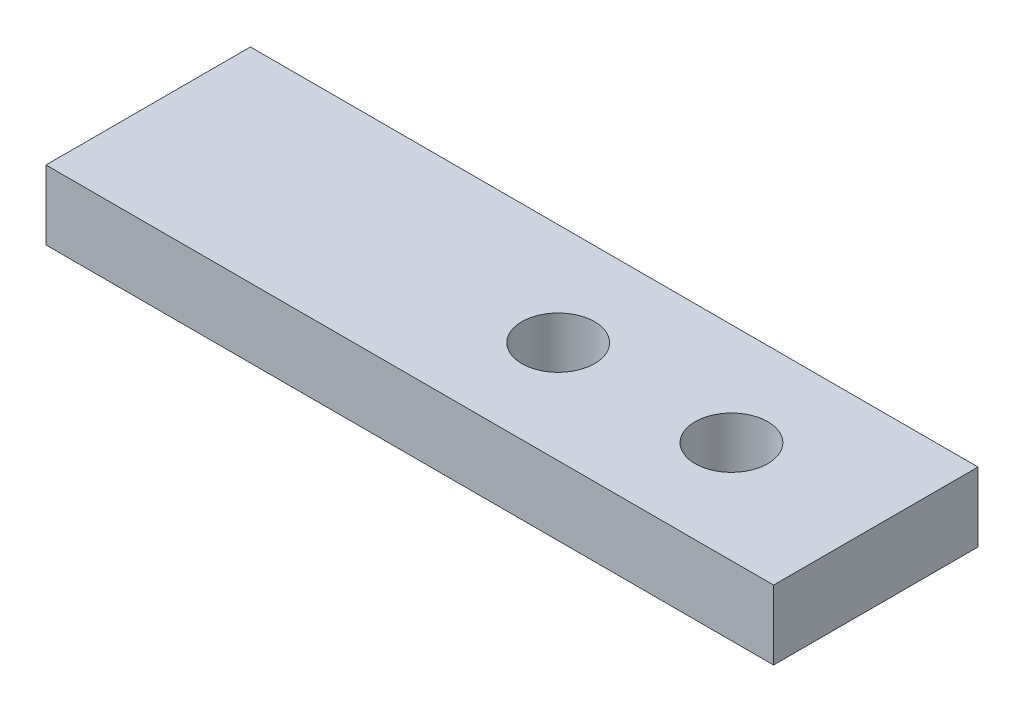
ISO-10303-21;
HEADER;
FILE_DESCRIPTION(('STEP AP214'),'2;1');
FILE_NAME('part.step','',(''),(''),'','','');
FILE_SCHEMA(('AUTOMOTIVE_DESIGN { 1 0 10303 214 1 1 1 1 }'));
ENDSEC;
DATA;
#1=APPLICATION_CONTEXT('core data for automotive mechanical design processes');
#2=APPLICATION_PROTOCOL_DEFINITION('international standard','automotive_design',2000,#1);
#3=PRODUCT_CONTEXT('',#1,'mechanical');
#4=PRODUCT('Part','Part','',(#3));
#5=PRODUCT_RELATED_PRODUCT_CATEGORY('part','',(#4));
#6=PRODUCT_DEFINITION_FORMATION('','',#4);
#7=PRODUCT_DEFINITION_CONTEXT('part definition',#1,'design');
#8=PRODUCT_DEFINITION('design','',#6,#7);
#9=PRODUCT_DEFINITION_SHAPE('','',#8);
#10=(LENGTH_UNIT() NAMED_UNIT(*) SI_UNIT(.MILLI.,.METRE.));
#11=(NAMED_UNIT(*) PLANE_ANGLE_UNIT() SI_UNIT($,.RADIAN.));
#12=(NAMED_UNIT(*) SI_UNIT($,.STERADIAN.) SOLID_ANGLE_UNIT());
#13=UNCERTAINTY_MEASURE_WITH_UNIT(LENGTH_MEASURE(1.E-05),#10,'distance_accuracy_value','');
#14=(GEOMETRIC_REPRESENTATION_CONTEXT(3) GLOBAL_UNCERTAINTY_ASSIGNED_CONTEXT((#13)) GLOBAL_UNIT_ASSIGNED_CONTEXT((#10,
#11,#12)) REPRESENTATION_CONTEXT('',''));
#15=CARTESIAN_POINT('',(0.,0.,0.));
#16=DIRECTION('',(0.,0.,1.));
#17=DIRECTION('',(1.,0.,0.));
#18=AXIS2_PLACEMENT_3D('',#15,#16,#17);
#19=CARTESIAN_POINT('',(0.,3.048,0.));
#20=DIRECTION('',(0.,1.,0.));
#21=DIRECTION('',(0.,0.,1.));
#22=AXIS2_PLACEMENT_3D('',#19,#20,#21);
#23=PLANE('',#22);
#24=CARTESIAN_POINT('',(9.652,3.048,0.));
#25=DIRECTION('',(0.,1.,0.));
#26=DIRECTION('',(0.,0.,1.));
#27=AXIS2_PLACEMENT_3D('',#24,#25,#26);
#28=CIRCLE('',#27,1.6002);
#29=CARTESIAN_POINT('',(9.652,3.048,-1.6002));
#30=VERTEX_POINT('',#29);
#31=EDGE_CURVE('E118',#30,#30,#28,.T.);
#32=ORIENTED_EDGE('',*,*,#31,.F.);
#33=EDGE_LOOP('',(#32));
#34=FACE_BOUND('',#33,.T.);
#35=DIRECTION('',(0.,0.,-1.));
#36=VECTOR('',#35,1.);
#37=CARTESIAN_POINT('',(16.002,3.048,-4.4958));
#38=LINE('',#37,#36);
#39=CARTESIAN_POINT('',(16.002,3.048,4.4958));
#40=VERTEX_POINT('',#39);
#41=CARTESIAN_POINT('',(16.002,3.048,-4.4958));
#42=VERTEX_POINT('',#41);
#43=EDGE_CURVE('E98',#40,#42,#38,.T.);
#44=ORIENTED_EDGE('',*,*,#43,.T.);
#45=DIRECTION('',(-1.,0.,0.));
#46=VECTOR('',#45,1.);
#47=CARTESIAN_POINT('',(-16.002,3.048,-4.4958));
#48=LINE('',#47,#46);
#49=CARTESIAN_POINT('',(-16.002,3.048,-4.4958));
#50=VERTEX_POINT('',#49);
#51=EDGE_CURVE('E93',#42,#50,#48,.T.);
#52=ORIENTED_EDGE('',*,*,#51,.T.);
#53=DIRECTION('',(0.,0.,1.));
#54=VECTOR('',#53,1.);
#55=CARTESIAN_POINT('',(-16.002,3.048,-4.4958));
#56=LINE('',#55,#54);
#57=CARTESIAN_POINT('',(-16.002,3.048,4.4958));
#58=VERTEX_POINT('',#57);
#59=EDGE_CURVE('E96',#50,#58,#56,.T.);
#60=ORIENTED_EDGE('',*,*,#59,.T.);
#61=DIRECTION('',(1.,0.,0.));
#62=VECTOR('',#61,1.);
#63=CARTESIAN_POINT('',(-16.002,3.048,4.4958));
#64=LINE('',#63,#62);
#65=EDGE_CURVE('E63',#58,#40,#64,.T.);
#66=ORIENTED_EDGE('',*,*,#65,.T.);
#67=EDGE_LOOP('',(#44,#52,#60,#66));
#68=FACE_BOUND('',#67,.T.);
#69=CARTESIAN_POINT('',(2.032,3.048,0.));
#70=DIRECTION('',(0.,1.,0.));
#71=DIRECTION('',(0.,0.,1.));
#72=AXIS2_PLACEMENT_3D('',#69,#70,#71);
#73=CIRCLE('',#72,1.6002);
#74=CARTESIAN_POINT('',(2.032,3.048,-1.6002));
#75=VERTEX_POINT('',#74);
#76=EDGE_CURVE('E140',#75,#75,#73,.T.);
#77=ORIENTED_EDGE('',*,*,#76,.F.);
#78=EDGE_LOOP('',(#77));
#79=FACE_BOUND('',#78,.T.);
#80=ADVANCED_FACE('F45',(#34,#68,#79),#23,.T.);
#81=CARTESIAN_POINT('',(0.,0.,0.));
#82=DIRECTION('',(0.,1.,0.));
#83=DIRECTION('',(0.,0.,1.));
#84=AXIS2_PLACEMENT_3D('',#81,#82,#83);
#85=PLANE('',#84);
#86=DIRECTION('',(0.,0.,-1.));
#87=VECTOR('',#86,1.);
#88=CARTESIAN_POINT('',(16.002,0.,-4.4958));
#89=LINE('',#88,#87);
#90=CARTESIAN_POINT('',(16.002,0.,4.4958));
#91=VERTEX_POINT('',#90);
#92=CARTESIAN_POINT('',(16.002,0.,-4.4958));
#93=VERTEX_POINT('',#92);
#94=EDGE_CURVE('E114',#91,#93,#89,.T.);
#95=ORIENTED_EDGE('',*,*,#94,.F.);
#96=DIRECTION('',(1.,0.,0.));
#97=VECTOR('',#96,1.);
#98=CARTESIAN_POINT('',(-16.002,0.,4.4958));
#99=LINE('',#98,#97);
#100=CARTESIAN_POINT('',(-16.002,0.,4.4958));
#101=VERTEX_POINT('',#100);
#102=EDGE_CURVE('E86',#101,#91,#99,.T.);
#103=ORIENTED_EDGE('',*,*,#102,.F.);
#104=DIRECTION('',(0.,0.,1.));
#105=VECTOR('',#104,1.);
#106=CARTESIAN_POINT('',(-16.002,0.,-4.4958));
#107=LINE('',#106,#105);
#108=CARTESIAN_POINT('',(-16.002,0.,-4.4958));
#109=VERTEX_POINT('',#108);
#110=EDGE_CURVE('E80',#109,#101,#107,.T.);
#111=ORIENTED_EDGE('',*,*,#110,.F.);
#112=DIRECTION('',(-1.,0.,0.));
#113=VECTOR('',#112,1.);
#114=CARTESIAN_POINT('',(-16.002,0.,-4.4958));
#115=LINE('',#114,#113);
#116=EDGE_CURVE('E103',#93,#109,#115,.T.);
#117=ORIENTED_EDGE('',*,*,#116,.F.);
#118=EDGE_LOOP('',(#95,#103,#111,#117));
#119=FACE_BOUND('',#118,.T.);
#120=CARTESIAN_POINT('',(9.652,0.,0.));
#121=DIRECTION('',(0.,1.,0.));
#122=DIRECTION('',(0.,0.,1.));
#123=AXIS2_PLACEMENT_3D('',#120,#121,#122);
#124=CIRCLE('',#123,1.6002);
#125=CARTESIAN_POINT('',(9.652,0.,-1.6002));
#126=VERTEX_POINT('',#125);
#127=EDGE_CURVE('E136',#126,#126,#124,.T.);
#128=ORIENTED_EDGE('',*,*,#127,.T.);
#129=EDGE_LOOP('',(#128));
#130=FACE_BOUND('',#129,.T.);
#131=CARTESIAN_POINT('',(2.032,0.,0.));
#132=DIRECTION('',(0.,1.,0.));
#133=DIRECTION('',(0.,0.,1.));
#134=AXIS2_PLACEMENT_3D('',#131,#132,#133);
#135=CIRCLE('',#134,1.6002);
#136=CARTESIAN_POINT('',(2.032,0.,-1.6002));
#137=VERTEX_POINT('',#136);
#138=EDGE_CURVE('E144',#137,#137,#135,.T.);
#139=ORIENTED_EDGE('',*,*,#138,.T.);
#140=EDGE_LOOP('',(#139));
#141=FACE_BOUND('',#140,.T.);
#142=ADVANCED_FACE('F131',(#119,#130,#141),#85,.F.);
#143=CARTESIAN_POINT('',(16.002,3.048,-4.4958));
#144=DIRECTION('',(-1.,0.,0.));
#145=DIRECTION('',(0.,0.,1.));
#146=AXIS2_PLACEMENT_3D('',#143,#144,#145);
#147=PLANE('',#146);
#148=ORIENTED_EDGE('',*,*,#94,.T.);
#149=DIRECTION('',(0.,-1.,0.));
#150=VECTOR('',#149,1.);
#151=CARTESIAN_POINT('',(16.002,3.048,-4.4958));
#152=LINE('',#151,#150);
#153=EDGE_CURVE('E11',#42,#93,#152,.T.);
#154=ORIENTED_EDGE('',*,*,#153,.F.);
#155=ORIENTED_EDGE('',*,*,#43,.F.);
#156=DIRECTION('',(0.,-1.,0.));
#157=VECTOR('',#156,1.);
#158=CARTESIAN_POINT('',(16.002,3.048,4.4958));
#159=LINE('',#158,#157);
#160=EDGE_CURVE('E110',#40,#91,#159,.T.);
#161=ORIENTED_EDGE('',*,*,#160,.T.);
#162=EDGE_LOOP('',(#148,#154,#155,#161));
#163=FACE_BOUND('',#162,.T.);
#164=ADVANCED_FACE('F47',(#163),#147,.F.);
#165=CARTESIAN_POINT('',(-16.002,3.048,-4.4958));
#166=DIRECTION('',(0.,0.,1.));
#167=DIRECTION('',(1.,0.,0.));
#168=AXIS2_PLACEMENT_3D('',#165,#166,#167);
#169=PLANE('',#168);
#170=ORIENTED_EDGE('',*,*,#116,.T.);
#171=DIRECTION('',(0.,-1.,0.));
#172=VECTOR('',#171,1.);
#173=CARTESIAN_POINT('',(-16.002,3.048,-4.4958));
#174=LINE('',#173,#172);
#175=EDGE_CURVE('E55',#50,#109,#174,.T.);
#176=ORIENTED_EDGE('',*,*,#175,.F.);
#177=ORIENTED_EDGE('',*,*,#51,.F.);
#178=ORIENTED_EDGE('',*,*,#153,.T.);
#179=EDGE_LOOP('',(#170,#176,#177,#178));
#180=FACE_BOUND('',#179,.T.);
#181=ADVANCED_FACE('F102',(#180),#169,.F.);
#182=CARTESIAN_POINT('',(-16.002,3.048,-4.4958));
#183=DIRECTION('',(1.,0.,0.));
#184=DIRECTION('',(0.,0.,-1.));
#185=AXIS2_PLACEMENT_3D('',#182,#183,#184);
#186=PLANE('',#185);
#187=ORIENTED_EDGE('',*,*,#110,.T.);
#188=DIRECTION('',(0.,-1.,0.));
#189=VECTOR('',#188,1.);
#190=CARTESIAN_POINT('',(-16.002,3.048,4.4958));
#191=LINE('',#190,#189);
#192=EDGE_CURVE('E105',#58,#101,#191,.T.);
#193=ORIENTED_EDGE('',*,*,#192,.F.);
#194=ORIENTED_EDGE('',*,*,#59,.F.);
#195=ORIENTED_EDGE('',*,*,#175,.T.);
#196=EDGE_LOOP('',(#187,#193,#194,#195));
#197=FACE_BOUND('',#196,.T.);
#198=ADVANCED_FACE('F106',(#197),#186,.F.);
#199=CARTESIAN_POINT('',(-16.002,3.048,4.4958));
#200=DIRECTION('',(0.,0.,-1.));
#201=DIRECTION('',(-1.,0.,0.));
#202=AXIS2_PLACEMENT_3D('',#199,#200,#201);
#203=PLANE('',#202);
#204=ORIENTED_EDGE('',*,*,#102,.T.);
#205=ORIENTED_EDGE('',*,*,#160,.F.);
#206=ORIENTED_EDGE('',*,*,#65,.F.);
#207=ORIENTED_EDGE('',*,*,#192,.T.);
#208=EDGE_LOOP('',(#204,#205,#206,#207));
#209=FACE_BOUND('',#208,.T.);
#210=ADVANCED_FACE('F128',(#209),#203,.F.);
#211=CARTESIAN_POINT('',(9.652,3.048,0.));
#212=DIRECTION('',(0.,-1.,0.));
#213=DIRECTION('',(0.,0.,-1.));
#214=AXIS2_PLACEMENT_3D('',#211,#212,#213);
#215=CYLINDRICAL_SURFACE('',#214,1.6002);
#216=CARTESIAN_POINT('',(9.652,3.048,-1.6002));
#217=CARTESIAN_POINT('',(9.652,3.01625,-1.6002));
#218=CARTESIAN_POINT('',(9.652,2.9845,-1.6002));
#219=CARTESIAN_POINT('',(9.652,2.921,-1.6002));
#220=CARTESIAN_POINT('',(9.652,2.88925,-1.6002));
#221=CARTESIAN_POINT('',(9.652,2.82575,-1.6002));
#222=CARTESIAN_POINT('',(9.652,2.794,-1.6002));
#223=CARTESIAN_POINT('',(9.652,2.7305,-1.6002));
#224=CARTESIAN_POINT('',(9.652,2.69875,-1.6002));
#225=CARTESIAN_POINT('',(9.652,2.63525,-1.6002));
#226=CARTESIAN_POINT('',(9.652,2.6035,-1.6002));
#227=CARTESIAN_POINT('',(9.652,2.54,-1.6002));
#228=CARTESIAN_POINT('',(9.652,2.50825,-1.6002));
#229=CARTESIAN_POINT('',(9.652,2.44475,-1.6002));
#230=CARTESIAN_POINT('',(9.652,2.413,-1.6002));
#231=CARTESIAN_POINT('',(9.652,2.3495,-1.6002));
#232=CARTESIAN_POINT('',(9.652,2.31775,-1.6002));
#233=CARTESIAN_POINT('',(9.652,2.25425,-1.6002));
#234=CARTESIAN_POINT('',(9.652,2.2225,-1.6002));
#235=CARTESIAN_POINT('',(9.652,2.159,-1.6002));
#236=CARTESIAN_POINT('',(9.652,2.12725,-1.6002));
#237=CARTESIAN_POINT('',(9.652,2.06375,-1.6002));
#238=CARTESIAN_POINT('',(9.652,2.032,-1.6002));
#239=CARTESIAN_POINT('',(9.652,1.9685,-1.6002));
#240=CARTESIAN_POINT('',(9.652,1.93675,-1.6002));
#241=CARTESIAN_POINT('',(9.652,1.87325,-1.6002));
#242=CARTESIAN_POINT('',(9.652,1.8415,-1.6002));
#243=CARTESIAN_POINT('',(9.652,1.778,-1.6002));
#244=CARTESIAN_POINT('',(9.652,1.74625,-1.6002));
#245=CARTESIAN_POINT('',(9.652,1.68275,-1.6002));
#246=CARTESIAN_POINT('',(9.652,1.651,-1.6002));
#247=CARTESIAN_POINT('',(9.652,1.5875,-1.6002));
#248=CARTESIAN_POINT('',(9.652,1.55575,-1.6002));
#249=CARTESIAN_POINT('',(9.652,1.49225,-1.6002));
#250=CARTESIAN_POINT('',(9.652,1.4605,-1.6002));
#251=CARTESIAN_POINT('',(9.652,1.397,-1.6002));
#252=CARTESIAN_POINT('',(9.652,1.36525,-1.6002));
#253=CARTESIAN_POINT('',(9.652,1.30175,-1.6002));
#254=CARTESIAN_POINT('',(9.652,1.27,-1.6002));
#255=CARTESIAN_POINT('',(9.652,1.2065,-1.6002));
#256=CARTESIAN_POINT('',(9.652,1.17475,-1.6002));
#257=CARTESIAN_POINT('',(9.652,1.11125,-1.6002));
#258=CARTESIAN_POINT('',(9.652,1.0795,-1.6002));
#259=CARTESIAN_POINT('',(9.652,1.016,-1.6002));
#260=CARTESIAN_POINT('',(9.652,0.98425,-1.6002));
#261=CARTESIAN_POINT('',(9.652,0.92075,-1.6002));
#262=CARTESIAN_POINT('',(9.652,0.889,-1.6002));
#263=CARTESIAN_POINT('',(9.652,0.8255,-1.6002));
#264=CARTESIAN_POINT('',(9.652,0.79375,-1.6002));
#265=CARTESIAN_POINT('',(9.652,0.73025,-1.6002));
#266=CARTESIAN_POINT('',(9.652,0.6985,-1.6002));
#267=CARTESIAN_POINT('',(9.652,0.635,-1.6002));
#268=CARTESIAN_POINT('',(9.652,0.60325,-1.6002));
#269=CARTESIAN_POINT('',(9.652,0.53975,-1.6002));
#270=CARTESIAN_POINT('',(9.652,0.508,-1.6002));
#271=CARTESIAN_POINT('',(9.652,0.4445,-1.6002));
#272=CARTESIAN_POINT('',(9.652,0.41275,-1.6002));
#273=CARTESIAN_POINT('',(9.652,0.34925,-1.6002));
#274=CARTESIAN_POINT('',(9.652,0.3175,-1.6002));
#275=CARTESIAN_POINT('',(9.652,0.254,-1.6002));
#276=CARTESIAN_POINT('',(9.652,0.22225,-1.6002));
#277=CARTESIAN_POINT('',(9.652,0.15875,-1.6002));
#278=CARTESIAN_POINT('',(9.652,0.127,-1.6002));
#279=CARTESIAN_POINT('',(9.652,0.0634999999999999,-1.6002));
#280=CARTESIAN_POINT('',(9.652,0.03175,-1.6002));
#281=CARTESIAN_POINT('',(9.652,0.,-1.6002));
#282=B_SPLINE_CURVE_WITH_KNOTS('',3,(#216,#217,#218,#219,#220,#221,#222,#223,#224,#225,#226,
#227,#228,#229,#230,#231,#232,#233,#234,#235,#236,#237,#238,#239,#240,#241,#242,#243,#244,#245,
#246,#247,#248,#249,#250,#251,#252,#253,#254,#255,#256,#257,#258,#259,#260,#261,#262,#263,#264,
#265,#266,#267,#268,#269,#270,#271,#272,#273,#274,#275,#276,#277,#278,#279,#280,#281),
.UNSPECIFIED.,.F.,.F.,(4,2,2,2,2,2,2,2,2,2,2,2,2,2,2,2,2,2,2,2,2,2,2,2,2,2,2,2,2,2,2,2,4),(0.,
0.0952499999999998,0.1905,0.28575,0.381,0.47625,0.5715,0.66675,0.762,0.85725,0.9525,1.04775,
1.143,1.23825,1.3335,1.42875,1.524,1.61925,1.7145,1.80975,1.905,2.00025,2.0955,2.19075,2.286,
2.38125,2.4765,2.57175,2.667,2.76225,2.8575,2.95275,3.048),.UNSPECIFIED.);
#283=EDGE_CURVE('BSEAM163',#30,#126,#282,.T.);
#284=ORIENTED_EDGE('',*,*,#31,.T.);
#285=ORIENTED_EDGE('',*,*,#127,.F.);
#286=ORIENTED_EDGE('',*,*,#283,.T.);
#287=ORIENTED_EDGE('',*,*,#283,.F.);
#288=EDGE_LOOP('',(#284,#286,#285,#287));
#289=FACE_BOUND('',#288,.T.);
#290=ADVANCED_FACE('F163',(#289),#215,.F.);
#291=CARTESIAN_POINT('',(2.032,3.048,0.));
#292=DIRECTION('',(0.,-1.,0.));
#293=DIRECTION('',(0.,0.,-1.));
#294=AXIS2_PLACEMENT_3D('',#291,#292,#293);
#295=CYLINDRICAL_SURFACE('',#294,1.6002);
#296=CARTESIAN_POINT('',(2.032,3.048,-1.6002));
#297=CARTESIAN_POINT('',(2.032,3.01625,-1.6002));
#298=CARTESIAN_POINT('',(2.032,2.9845,-1.6002));
#299=CARTESIAN_POINT('',(2.032,2.921,-1.6002));
#300=CARTESIAN_POINT('',(2.032,2.88925,-1.6002));
#301=CARTESIAN_POINT('',(2.032,2.82575,-1.6002));
#302=CARTESIAN_POINT('',(2.032,2.794,-1.6002));
#303=CARTESIAN_POINT('',(2.032,2.7305,-1.6002));
#304=CARTESIAN_POINT('',(2.032,2.69875,-1.6002));
#305=CARTESIAN_POINT('',(2.032,2.63525,-1.6002));
#306=CARTESIAN_POINT('',(2.032,2.6035,-1.6002));
#307=CARTESIAN_POINT('',(2.032,2.54,-1.6002));
#308=CARTESIAN_POINT('',(2.032,2.50825,-1.6002));
#309=CARTESIAN_POINT('',(2.032,2.44475,-1.6002));
#310=CARTESIAN_POINT('',(2.032,2.413,-1.6002));
#311=CARTESIAN_POINT('',(2.032,2.3495,-1.6002));
#312=CARTESIAN_POINT('',(2.032,2.31775,-1.6002));
#313=CARTESIAN_POINT('',(2.032,2.25425,-1.6002));
#314=CARTESIAN_POINT('',(2.032,2.2225,-1.6002));
#315=CARTESIAN_POINT('',(2.032,2.159,-1.6002));
#316=CARTESIAN_POINT('',(2.032,2.12725,-1.6002));
#317=CARTESIAN_POINT('',(2.032,2.06375,-1.6002));
#318=CARTESIAN_POINT('',(2.032,2.032,-1.6002));
#319=CARTESIAN_POINT('',(2.032,1.9685,-1.6002));
#320=CARTESIAN_POINT('',(2.032,1.93675,-1.6002));
#321=CARTESIAN_POINT('',(2.032,1.87325,-1.6002));
#322=CARTESIAN_POINT('',(2.032,1.8415,-1.6002));
#323=CARTESIAN_POINT('',(2.032,1.778,-1.6002));
#324=CARTESIAN_POINT('',(2.032,1.74625,-1.6002));
#325=CARTESIAN_POINT('',(2.032,1.68275,-1.6002));
#326=CARTESIAN_POINT('',(2.032,1.651,-1.6002));
#327=CARTESIAN_POINT('',(2.032,1.5875,-1.6002));
#328=CARTESIAN_POINT('',(2.032,1.55575,-1.6002));
#329=CARTESIAN_POINT('',(2.032,1.49225,-1.6002));
#330=CARTESIAN_POINT('',(2.032,1.4605,-1.6002));
#331=CARTESIAN_POINT('',(2.032,1.397,-1.6002));
#332=CARTESIAN_POINT('',(2.032,1.36525,-1.6002));
#333=CARTESIAN_POINT('',(2.032,1.30175,-1.6002));
#334=CARTESIAN_POINT('',(2.032,1.27,-1.6002));
#335=CARTESIAN_POINT('',(2.032,1.2065,-1.6002));
#336=CARTESIAN_POINT('',(2.032,1.17475,-1.6002));
#337=CARTESIAN_POINT('',(2.032,1.11125,-1.6002));
#338=CARTESIAN_POINT('',(2.032,1.0795,-1.6002));
#339=CARTESIAN_POINT('',(2.032,1.016,-1.6002));
#340=CARTESIAN_POINT('',(2.032,0.98425,-1.6002));
#341=CARTESIAN_POINT('',(2.032,0.92075,-1.6002));
#342=CARTESIAN_POINT('',(2.032,0.889,-1.6002));
#343=CARTESIAN_POINT('',(2.032,0.8255,-1.6002));
#344=CARTESIAN_POINT('',(2.032,0.79375,-1.6002));
#345=CARTESIAN_POINT('',(2.032,0.73025,-1.6002));
#346=CARTESIAN_POINT('',(2.032,0.6985,-1.6002));
#347=CARTESIAN_POINT('',(2.032,0.635,-1.6002));
#348=CARTESIAN_POINT('',(2.032,0.60325,-1.6002));
#349=CARTESIAN_POINT('',(2.032,0.53975,-1.6002));
#350=CARTESIAN_POINT('',(2.032,0.508,-1.6002));
#351=CARTESIAN_POINT('',(2.032,0.4445,-1.6002));
#352=CARTESIAN_POINT('',(2.032,0.41275,-1.6002));
#353=CARTESIAN_POINT('',(2.032,0.34925,-1.6002));
#354=CARTESIAN_POINT('',(2.032,0.3175,-1.6002));
#355=CARTESIAN_POINT('',(2.032,0.254,-1.6002));
#356=CARTESIAN_POINT('',(2.032,0.22225,-1.6002));
#357=CARTESIAN_POINT('',(2.032,0.15875,-1.6002));
#358=CARTESIAN_POINT('',(2.032,0.127,-1.6002));
#359=CARTESIAN_POINT('',(2.032,0.0634999999999999,-1.6002));
#360=CARTESIAN_POINT('',(2.032,0.03175,-1.6002));
#361=CARTESIAN_POINT('',(2.032,0.,-1.6002));
#362=B_SPLINE_CURVE_WITH_KNOTS('',3,(#296,#297,#298,#299,#300,#301,#302,#303,#304,#305,#306,
#307,#308,#309,#310,#311,#312,#313,#314,#315,#316,#317,#318,#319,#320,#321,#322,#323,#324,#325,
#326,#327,#328,#329,#330,#331,#332,#333,#334,#335,#336,#337,#338,#339,#340,#341,#342,#343,#344,
#345,#346,#347,#348,#349,#350,#351,#352,#353,#354,#355,#356,#357,#358,#359,#360,#361),
.UNSPECIFIED.,.F.,.F.,(4,2,2,2,2,2,2,2,2,2,2,2,2,2,2,2,2,2,2,2,2,2,2,2,2,2,2,2,2,2,2,2,4),(0.,
0.0952499999999998,0.1905,0.28575,0.381,0.47625,0.5715,0.66675,0.762,0.85725,0.9525,1.04775,
1.143,1.23825,1.3335,1.42875,1.524,1.61925,1.7145,1.80975,1.905,2.00025,2.0955,2.19075,2.286,
2.38125,2.4765,2.57175,2.667,2.76225,2.8575,2.95275,3.048),.UNSPECIFIED.);
#363=EDGE_CURVE('BSEAM152',#75,#137,#362,.T.);
#364=ORIENTED_EDGE('',*,*,#76,.T.);
#365=ORIENTED_EDGE('',*,*,#138,.F.);
#366=ORIENTED_EDGE('',*,*,#363,.T.);
#367=ORIENTED_EDGE('',*,*,#363,.F.);
#368=EDGE_LOOP('',(#364,#366,#365,#367));
#369=FACE_BOUND('',#368,.T.);
#370=ADVANCED_FACE('F152',(#369),#295,.F.);
#371=CLOSED_SHELL('',(#80,#142,#164,#181,#198,#210,#290,#370));
#372=MANIFOLD_SOLID_BREP('B2',#371);
#373=ADVANCED_BREP_SHAPE_REPRESENTATION('',(#18,#372),#14);
#374=SHAPE_DEFINITION_REPRESENTATION(#9,#373);
ENDSEC;
END-ISO-10303-21;
